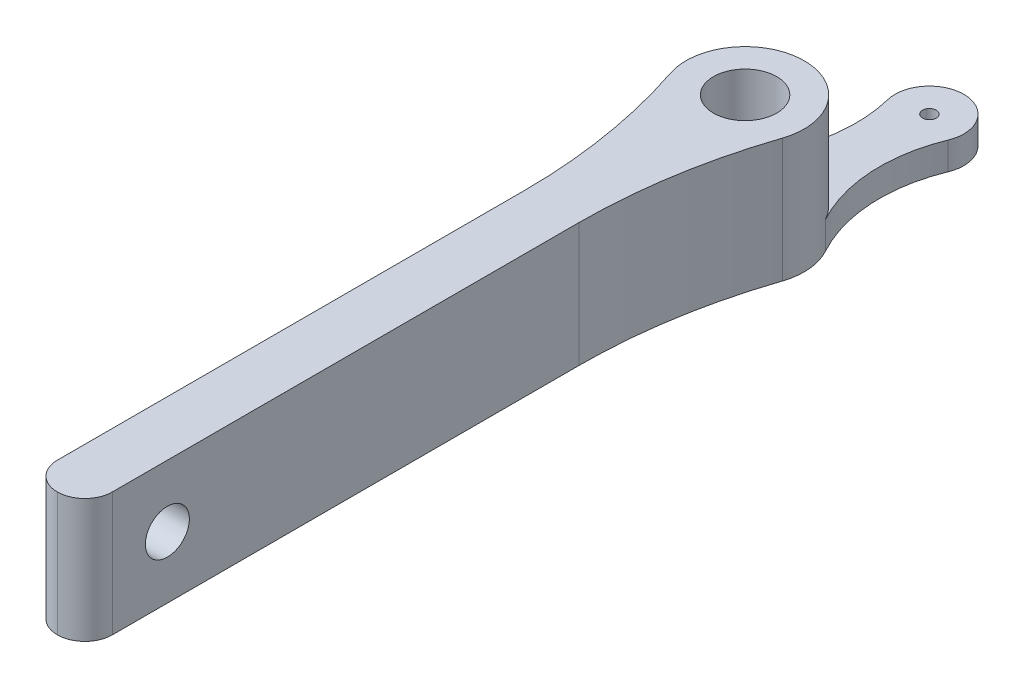
ISO-10303-21;
HEADER;
FILE_DESCRIPTION(('STEP AP214'),'2;1');
FILE_NAME('part.step','',(''),(''),'','','');
FILE_SCHEMA(('AUTOMOTIVE_DESIGN { 1 0 10303 214 1 1 1 1 }'));
ENDSEC;
DATA;
#1=APPLICATION_CONTEXT('core data for automotive mechanical design processes');
#2=APPLICATION_PROTOCOL_DEFINITION('international standard','automotive_design',2000,#1);
#3=PRODUCT_CONTEXT('',#1,'mechanical');
#4=PRODUCT('Part','Part','',(#3));
#5=PRODUCT_RELATED_PRODUCT_CATEGORY('part','',(#4));
#6=PRODUCT_DEFINITION_FORMATION('','',#4);
#7=PRODUCT_DEFINITION_CONTEXT('part definition',#1,'design');
#8=PRODUCT_DEFINITION('design','',#6,#7);
#9=PRODUCT_DEFINITION_SHAPE('','',#8);
#10=(LENGTH_UNIT() NAMED_UNIT(*) SI_UNIT(.MILLI.,.METRE.));
#11=(NAMED_UNIT(*) PLANE_ANGLE_UNIT() SI_UNIT($,.RADIAN.));
#12=(NAMED_UNIT(*) SI_UNIT($,.STERADIAN.) SOLID_ANGLE_UNIT());
#13=UNCERTAINTY_MEASURE_WITH_UNIT(LENGTH_MEASURE(1.E-05),#10,'distance_accuracy_value','');
#14=(GEOMETRIC_REPRESENTATION_CONTEXT(3) GLOBAL_UNCERTAINTY_ASSIGNED_CONTEXT((#13)) GLOBAL_UNIT_ASSIGNED_CONTEXT((#10,
#11,#12)) REPRESENTATION_CONTEXT('',''));
#15=CARTESIAN_POINT('',(0.,0.,0.));
#16=DIRECTION('',(0.,0.,1.));
#17=DIRECTION('',(1.,0.,0.));
#18=AXIS2_PLACEMENT_3D('',#15,#16,#17);
#19=CARTESIAN_POINT('',(0.,57.15,0.));
#20=DIRECTION('',(0.,-1.,0.));
#21=DIRECTION('',(0.,0.,-1.));
#22=AXIS2_PLACEMENT_3D('',#19,#20,#21);
#23=CYLINDRICAL_SURFACE('',#22,27.305);
#24=DIRECTION('',(0.,-1.,0.));
#25=VECTOR('',#24,1.);
#26=CARTESIAN_POINT('',(23.9257190893065,12.7,-13.1576210258387));
#27=LINE('',#26,#25);
#28=CARTESIAN_POINT('',(23.9257190893065,12.7,-13.1576210258387));
#29=VERTEX_POINT('',#28);
#30=CARTESIAN_POINT('',(23.9257190893065,0.,-13.1576210258387));
#31=VERTEX_POINT('',#30);
#32=EDGE_CURVE('E246',#29,#31,#27,.T.);
#33=ORIENTED_EDGE('',*,*,#32,.F.);
#34=CARTESIAN_POINT('',(0.,12.7,0.));
#35=DIRECTION('',(0.,-1.,0.));
#36=DIRECTION('',(0.,0.,1.));
#37=AXIS2_PLACEMENT_3D('',#34,#35,#36);
#38=CIRCLE('',#37,27.305);
#39=CARTESIAN_POINT('',(-21.7584687923652,12.7,-16.4964256980616));
#40=VERTEX_POINT('',#39);
#41=EDGE_CURVE('E140',#40,#29,#38,.T.);
#42=ORIENTED_EDGE('',*,*,#41,.F.);
#43=DIRECTION('',(0.,-1.,0.));
#44=VECTOR('',#43,1.);
#45=CARTESIAN_POINT('',(-21.7584687923652,12.7,-16.4964256980616));
#46=LINE('',#45,#44);
#47=CARTESIAN_POINT('',(-21.7584687923652,0.,-16.4964256980616));
#48=VERTEX_POINT('',#47);
#49=EDGE_CURVE('E153',#40,#48,#46,.T.);
#50=ORIENTED_EDGE('',*,*,#49,.T.);
#51=CARTESIAN_POINT('',(0.,0.,0.));
#52=DIRECTION('',(0.,1.,0.));
#53=DIRECTION('',(0.,0.,1.));
#54=AXIS2_PLACEMENT_3D('',#51,#52,#53);
#55=CIRCLE('',#54,27.305);
#56=CARTESIAN_POINT('',(-25.8873589164786,0.,8.68375917039493));
#57=VERTEX_POINT('',#56);
#58=EDGE_CURVE('E160',#48,#57,#55,.T.);
#59=ORIENTED_EDGE('',*,*,#58,.T.);
#60=DIRECTION('',(0.,-1.,0.));
#61=VECTOR('',#60,1.);
#62=CARTESIAN_POINT('',(-25.8873589164786,57.15,8.68375917039493));
#63=LINE('',#62,#61);
#64=CARTESIAN_POINT('',(-25.8873589164786,57.15,8.68375917039493));
#65=VERTEX_POINT('',#64);
#66=EDGE_CURVE('E172',#57,#65,#63,.F.);
#67=ORIENTED_EDGE('',*,*,#66,.T.);
#68=CARTESIAN_POINT('',(0.,57.15,0.));
#69=DIRECTION('',(0.,1.,0.));
#70=DIRECTION('',(0.,0.,1.));
#71=AXIS2_PLACEMENT_3D('',#68,#69,#70);
#72=CIRCLE('',#71,27.305);
#73=CARTESIAN_POINT('',(25.8873589164786,57.15,8.68375917039493));
#74=VERTEX_POINT('',#73);
#75=EDGE_CURVE('E164',#74,#65,#72,.T.);
#76=ORIENTED_EDGE('',*,*,#75,.F.);
#77=DIRECTION('',(0.,-1.,0.));
#78=VECTOR('',#77,1.);
#79=CARTESIAN_POINT('',(25.8873589164786,57.15,8.68375917039493));
#80=LINE('',#79,#78);
#81=CARTESIAN_POINT('',(25.8873589164786,0.,8.68375917039493));
#82=VERTEX_POINT('',#81);
#83=EDGE_CURVE('E181',#74,#82,#80,.T.);
#84=ORIENTED_EDGE('',*,*,#83,.T.);
#85=EDGE_CURVE('E173',#82,#31,#55,.T.);
#86=ORIENTED_EDGE('',*,*,#85,.T.);
#87=EDGE_LOOP('',(#33,#42,#50,#59,#67,#76,#84,#86));
#88=FACE_BOUND('',#87,.T.);
#89=ADVANCED_FACE('F43',(#88),#23,.T.);
#90=CARTESIAN_POINT('',(0.,57.15,0.));
#91=DIRECTION('',(0.,1.,0.));
#92=DIRECTION('',(0.,0.,1.));
#93=AXIS2_PLACEMENT_3D('',#90,#91,#92);
#94=PLANE('',#93);
#95=DIRECTION('',(0.,0.,1.));
#96=VECTOR('',#95,1.);
#97=CARTESIAN_POINT('',(-12.7000000000001,57.15,24.1717402145563));
#98=LINE('',#97,#96);
#99=CARTESIAN_POINT('',(-12.7000000000001,57.15,89.462914243836));
#100=VERTEX_POINT('',#99);
#101=CARTESIAN_POINT('',(-12.7,57.15,304.8));
#102=VERTEX_POINT('',#101);
#103=EDGE_CURVE('E167',#100,#102,#98,.T.);
#104=ORIENTED_EDGE('',*,*,#103,.T.);
#105=CARTESIAN_POINT('',(0.,57.15,304.8));
#106=DIRECTION('',(0.,1.,0.));
#107=DIRECTION('',(0.,0.,1.));
#108=AXIS2_PLACEMENT_3D('',#105,#106,#107);
#109=CIRCLE('',#108,12.7);
#110=CARTESIAN_POINT('',(0.,57.15,317.5));
#111=VERTEX_POINT('',#110);
#112=EDGE_CURVE('E52',#102,#111,#109,.T.);
#113=ORIENTED_EDGE('',*,*,#112,.T.);
#114=CARTESIAN_POINT('',(0.,57.15,304.8));
#115=DIRECTION('',(0.,1.,0.));
#116=DIRECTION('',(0.,0.,1.));
#117=AXIS2_PLACEMENT_3D('',#114,#115,#116);
#118=CIRCLE('',#117,12.7);
#119=CARTESIAN_POINT('',(12.7,57.15,304.8));
#120=VERTEX_POINT('',#119);
#121=EDGE_CURVE('E62',#111,#120,#118,.T.);
#122=ORIENTED_EDGE('',*,*,#121,.T.);
#123=DIRECTION('',(0.,0.,-1.));
#124=VECTOR('',#123,1.);
#125=CARTESIAN_POINT('',(12.7000000000001,57.15,24.1717402145563));
#126=LINE('',#125,#124);
#127=CARTESIAN_POINT('',(12.7000000000001,57.15,89.462914243836));
#128=VERTEX_POINT('',#127);
#129=EDGE_CURVE('E170',#120,#128,#126,.T.);
#130=ORIENTED_EDGE('',*,*,#129,.T.);
#131=CARTESIAN_POINT('',(266.7,57.15,89.4629142438361));
#132=DIRECTION('',(0.,1.,0.));
#133=DIRECTION('',(0.,0.,1.));
#134=AXIS2_PLACEMENT_3D('',#131,#132,#133);
#135=CIRCLE('',#134,254.);
#136=EDGE_CURVE('E193',#128,#74,#135,.F.);
#137=ORIENTED_EDGE('',*,*,#136,.T.);
#138=ORIENTED_EDGE('',*,*,#75,.T.);
#139=CARTESIAN_POINT('',(-266.7,57.15,89.4629142438361));
#140=DIRECTION('',(0.,1.,0.));
#141=DIRECTION('',(0.,0.,1.));
#142=AXIS2_PLACEMENT_3D('',#139,#140,#141);
#143=CIRCLE('',#142,254.);
#144=EDGE_CURVE('E198',#65,#100,#143,.F.);
#145=ORIENTED_EDGE('',*,*,#144,.T.);
#146=EDGE_LOOP('',(#104,#113,#122,#130,#137,#138,#145));
#147=FACE_BOUND('',#146,.T.);
#148=CARTESIAN_POINT('',(0.,57.15,0.));
#149=DIRECTION('',(0.,1.,0.));
#150=DIRECTION('',(0.,0.,1.));
#151=AXIS2_PLACEMENT_3D('',#148,#149,#150);
#152=CIRCLE('',#151,14.605);
#153=CARTESIAN_POINT('',(0.,57.15,14.605));
#154=VERTEX_POINT('',#153);
#155=EDGE_CURVE('E157',#154,#154,#152,.T.);
#156=ORIENTED_EDGE('',*,*,#155,.F.);
#157=EDGE_LOOP('',(#156));
#158=FACE_BOUND('',#157,.T.);
#159=ADVANCED_FACE('F218',(#147,#158),#94,.T.);
#160=CARTESIAN_POINT('',(0.,0.,0.));
#161=DIRECTION('',(0.,1.,0.));
#162=DIRECTION('',(0.,0.,1.));
#163=AXIS2_PLACEMENT_3D('',#160,#161,#162);
#164=PLANE('',#163);
#165=CARTESIAN_POINT('',(0.,0.,304.8));
#166=DIRECTION('',(0.,1.,0.));
#167=DIRECTION('',(0.,0.,1.));
#168=AXIS2_PLACEMENT_3D('',#165,#166,#167);
#169=CIRCLE('',#168,12.7);
#170=CARTESIAN_POINT('',(12.7,0.,304.8));
#171=VERTEX_POINT('',#170);
#172=CARTESIAN_POINT('',(0.,0.,317.5));
#173=VERTEX_POINT('',#172);
#174=EDGE_CURVE('E200',#171,#173,#169,.F.);
#175=ORIENTED_EDGE('',*,*,#174,.T.);
#176=CARTESIAN_POINT('',(0.,0.,304.8));
#177=DIRECTION('',(0.,1.,0.));
#178=DIRECTION('',(0.,0.,1.));
#179=AXIS2_PLACEMENT_3D('',#176,#177,#178);
#180=CIRCLE('',#179,12.7);
#181=CARTESIAN_POINT('',(-12.7,0.,304.8));
#182=VERTEX_POINT('',#181);
#183=EDGE_CURVE('E204',#173,#182,#180,.F.);
#184=ORIENTED_EDGE('',*,*,#183,.T.);
#185=DIRECTION('',(0.,0.,1.));
#186=VECTOR('',#185,1.);
#187=CARTESIAN_POINT('',(-12.7000000000001,0.,24.1717402145563));
#188=LINE('',#187,#186);
#189=CARTESIAN_POINT('',(-12.7000000000001,0.,89.462914243836));
#190=VERTEX_POINT('',#189);
#191=EDGE_CURVE('E176',#190,#182,#188,.T.);
#192=ORIENTED_EDGE('',*,*,#191,.F.);
#193=CARTESIAN_POINT('',(-266.7,0.,89.4629142438361));
#194=DIRECTION('',(0.,1.,0.));
#195=DIRECTION('',(0.,0.,1.));
#196=AXIS2_PLACEMENT_3D('',#193,#194,#195);
#197=CIRCLE('',#196,254.);
#198=EDGE_CURVE('E195',#190,#57,#197,.T.);
#199=ORIENTED_EDGE('',*,*,#198,.T.);
#200=ORIENTED_EDGE('',*,*,#58,.F.);
#201=CARTESIAN_POINT('',(-77.4196680286484,0.,-58.6965844605449));
#202=DIRECTION('',(0.,-1.,0.));
#203=DIRECTION('',(0.,0.,-1.));
#204=AXIS2_PLACEMENT_3D('',#201,#202,#203);
#205=CIRCLE('',#204,69.85);
#206=CARTESIAN_POINT('',(-9.6152003930738,0.,-75.4768308430126));
#207=VERTEX_POINT('',#206);
#208=EDGE_CURVE('E143',#207,#48,#205,.T.);
#209=ORIENTED_EDGE('',*,*,#208,.F.);
#210=CARTESIAN_POINT('',(5.7949058877386,0.,-79.2905232026643));
#211=DIRECTION('',(0.,1.,0.));
#212=DIRECTION('',(0.,0.,1.));
#213=AXIS2_PLACEMENT_3D('',#210,#211,#212);
#214=CIRCLE('',#213,15.875);
#215=CARTESIAN_POINT('',(20.4867838700433,0.,-73.2768432682921));
#216=VERTEX_POINT('',#215);
#217=EDGE_CURVE('E248',#216,#207,#214,.T.);
#218=ORIENTED_EDGE('',*,*,#217,.F.);
#219=CARTESIAN_POINT('',(85.1310469921837,0.,-46.816651557054));
#220=DIRECTION('',(0.,-1.,0.));
#221=DIRECTION('',(0.,0.,1.));
#222=AXIS2_PLACEMENT_3D('',#219,#220,#221);
#223=CIRCLE('',#222,69.85);
#224=EDGE_CURVE('E147',#31,#216,#223,.T.);
#225=ORIENTED_EDGE('',*,*,#224,.F.);
#226=ORIENTED_EDGE('',*,*,#85,.F.);
#227=CARTESIAN_POINT('',(266.7,0.,89.4629142438361));
#228=DIRECTION('',(0.,1.,0.));
#229=DIRECTION('',(0.,0.,1.));
#230=AXIS2_PLACEMENT_3D('',#227,#228,#229);
#231=CIRCLE('',#230,254.);
#232=CARTESIAN_POINT('',(12.7000000000001,0.,89.462914243836));
#233=VERTEX_POINT('',#232);
#234=EDGE_CURVE('E190',#82,#233,#231,.T.);
#235=ORIENTED_EDGE('',*,*,#234,.T.);
#236=DIRECTION('',(0.,0.,-1.));
#237=VECTOR('',#236,1.);
#238=CARTESIAN_POINT('',(12.7000000000001,0.,24.1717402145563));
#239=LINE('',#238,#237);
#240=EDGE_CURVE('E168',#171,#233,#239,.T.);
#241=ORIENTED_EDGE('',*,*,#240,.F.);
#242=EDGE_LOOP('',(#175,#184,#192,#199,#200,#209,#218,#225,#226,#235,#241));
#243=FACE_BOUND('',#242,.T.);
#244=CARTESIAN_POINT('',(0.,0.,0.));
#245=DIRECTION('',(0.,1.,0.));
#246=DIRECTION('',(0.,0.,1.));
#247=AXIS2_PLACEMENT_3D('',#244,#245,#246);
#248=CIRCLE('',#247,14.605);
#249=CARTESIAN_POINT('',(0.,0.,14.605));
#250=VERTEX_POINT('',#249);
#251=EDGE_CURVE('E161',#250,#250,#248,.T.);
#252=ORIENTED_EDGE('',*,*,#251,.T.);
#253=EDGE_LOOP('',(#252));
#254=FACE_BOUND('',#253,.T.);
#255=CARTESIAN_POINT('',(5.7949058877386,0.,-79.2905232026643));
#256=DIRECTION('',(0.,1.,0.));
#257=DIRECTION('',(0.,0.,1.));
#258=AXIS2_PLACEMENT_3D('',#255,#256,#257);
#259=CIRCLE('',#258,3.175);
#260=CARTESIAN_POINT('',(5.7949058877386,0.,-76.1155232026643));
#261=VERTEX_POINT('',#260);
#262=EDGE_CURVE('E235',#261,#261,#259,.T.);
#263=ORIENTED_EDGE('',*,*,#262,.T.);
#264=EDGE_LOOP('',(#263));
#265=FACE_BOUND('',#264,.T.);
#266=ADVANCED_FACE('F226',(#243,#254,#265),#164,.F.);
#267=CARTESIAN_POINT('',(-12.7000000000001,57.15,24.1717402145563));
#268=DIRECTION('',(1.,0.,0.));
#269=DIRECTION('',(0.,0.,-1.));
#270=AXIS2_PLACEMENT_3D('',#267,#268,#269);
#271=PLANE('',#270);
#272=CARTESIAN_POINT('',(-12.7,28.5750000000001,279.4));
#273=DIRECTION('',(-1.,0.,0.));
#274=DIRECTION('',(0.,0.,1.));
#275=AXIS2_PLACEMENT_3D('',#272,#273,#274);
#276=CIRCLE('',#275,10.16);
#277=CARTESIAN_POINT('',(-12.7,28.5750000000001,289.56));
#278=VERTEX_POINT('',#277);
#279=EDGE_CURVE('E148',#278,#278,#276,.T.);
#280=ORIENTED_EDGE('',*,*,#279,.F.);
#281=EDGE_LOOP('',(#280));
#282=FACE_BOUND('',#281,.T.);
#283=ORIENTED_EDGE('',*,*,#191,.T.);
#284=DIRECTION('',(0.,-1.,0.));
#285=VECTOR('',#284,1.);
#286=CARTESIAN_POINT('',(-12.7,57.15,304.8));
#287=LINE('',#286,#285);
#288=EDGE_CURVE('E206',#182,#102,#287,.F.);
#289=ORIENTED_EDGE('',*,*,#288,.T.);
#290=ORIENTED_EDGE('',*,*,#103,.F.);
#291=DIRECTION('',(0.,1.,0.));
#292=VECTOR('',#291,1.);
#293=CARTESIAN_POINT('',(-12.7000000000001,0.,89.462914243836));
#294=LINE('',#293,#292);
#295=EDGE_CURVE('E187',#100,#190,#294,.F.);
#296=ORIENTED_EDGE('',*,*,#295,.T.);
#297=EDGE_LOOP('',(#283,#289,#290,#296));
#298=FACE_BOUND('',#297,.T.);
#299=ADVANCED_FACE('F213',(#282,#298),#271,.F.);
#300=CARTESIAN_POINT('',(12.7000000000001,57.15,24.1717402145563));
#301=DIRECTION('',(-1.,0.,0.));
#302=DIRECTION('',(0.,0.,1.));
#303=AXIS2_PLACEMENT_3D('',#300,#301,#302);
#304=PLANE('',#303);
#305=CARTESIAN_POINT('',(12.7,28.5750000000001,279.4));
#306=DIRECTION('',(-1.,0.,0.));
#307=DIRECTION('',(0.,0.,1.));
#308=AXIS2_PLACEMENT_3D('',#305,#306,#307);
#309=CIRCLE('',#308,10.16);
#310=CARTESIAN_POINT('',(12.7,28.5750000000001,289.56));
#311=VERTEX_POINT('',#310);
#312=EDGE_CURVE('E151',#311,#311,#309,.T.);
#313=ORIENTED_EDGE('',*,*,#312,.T.);
#314=EDGE_LOOP('',(#313));
#315=FACE_BOUND('',#314,.T.);
#316=ORIENTED_EDGE('',*,*,#129,.F.);
#317=DIRECTION('',(0.,1.,0.));
#318=VECTOR('',#317,1.);
#319=CARTESIAN_POINT('',(12.7,0.,304.8));
#320=LINE('',#319,#318);
#321=EDGE_CURVE('E11',#120,#171,#320,.F.);
#322=ORIENTED_EDGE('',*,*,#321,.T.);
#323=ORIENTED_EDGE('',*,*,#240,.T.);
#324=DIRECTION('',(0.,1.,0.));
#325=VECTOR('',#324,1.);
#326=CARTESIAN_POINT('',(12.7000000000001,57.15,89.462914243836));
#327=LINE('',#326,#325);
#328=EDGE_CURVE('E184',#233,#128,#327,.T.);
#329=ORIENTED_EDGE('',*,*,#328,.T.);
#330=EDGE_LOOP('',(#316,#322,#323,#329));
#331=FACE_BOUND('',#330,.T.);
#332=ADVANCED_FACE('F292',(#315,#331),#304,.F.);
#333=CARTESIAN_POINT('',(0.,57.15,0.));
#334=DIRECTION('',(0.,-1.,0.));
#335=DIRECTION('',(0.,0.,-1.));
#336=AXIS2_PLACEMENT_3D('',#333,#334,#335);
#337=CYLINDRICAL_SURFACE('',#336,14.605);
#338=ORIENTED_EDGE('',*,*,#155,.T.);
#339=EDGE_LOOP('',(#338));
#340=FACE_BOUND('',#339,.T.);
#341=ORIENTED_EDGE('',*,*,#251,.F.);
#342=EDGE_LOOP('',(#341));
#343=FACE_BOUND('',#342,.T.);
#344=ADVANCED_FACE('F280',(#340,#343),#337,.F.);
#345=CARTESIAN_POINT('',(266.7,57.15,89.4629142438361));
#346=DIRECTION('',(0.,-1.,0.));
#347=DIRECTION('',(0.,0.,-1.));
#348=AXIS2_PLACEMENT_3D('',#345,#346,#347);
#349=CYLINDRICAL_SURFACE('',#348,254.);
#350=ORIENTED_EDGE('',*,*,#136,.F.);
#351=ORIENTED_EDGE('',*,*,#328,.F.);
#352=ORIENTED_EDGE('',*,*,#234,.F.);
#353=ORIENTED_EDGE('',*,*,#83,.F.);
#354=EDGE_LOOP('',(#350,#351,#352,#353));
#355=FACE_BOUND('',#354,.T.);
#356=ADVANCED_FACE('F277',(#355),#349,.F.);
#357=CARTESIAN_POINT('',(-266.7,57.15,89.4629142438361));
#358=DIRECTION('',(0.,-1.,0.));
#359=DIRECTION('',(0.,0.,-1.));
#360=AXIS2_PLACEMENT_3D('',#357,#358,#359);
#361=CYLINDRICAL_SURFACE('',#360,254.);
#362=ORIENTED_EDGE('',*,*,#144,.F.);
#363=ORIENTED_EDGE('',*,*,#66,.F.);
#364=ORIENTED_EDGE('',*,*,#198,.F.);
#365=ORIENTED_EDGE('',*,*,#295,.F.);
#366=EDGE_LOOP('',(#362,#363,#364,#365));
#367=FACE_BOUND('',#366,.T.);
#368=ADVANCED_FACE('F224',(#367),#361,.F.);
#369=CARTESIAN_POINT('',(27.3050000000001,28.5750000000001,279.4));
#370=DIRECTION('',(-1.,0.,0.));
#371=DIRECTION('',(0.,0.,1.));
#372=AXIS2_PLACEMENT_3D('',#369,#370,#371);
#373=CYLINDRICAL_SURFACE('',#372,10.16);
#374=ORIENTED_EDGE('',*,*,#279,.T.);
#375=EDGE_LOOP('',(#374));
#376=FACE_BOUND('',#375,.T.);
#377=ORIENTED_EDGE('',*,*,#312,.F.);
#378=EDGE_LOOP('',(#377));
#379=FACE_BOUND('',#378,.T.);
#380=ADVANCED_FACE('F283',(#376,#379),#373,.F.);
#381=CARTESIAN_POINT('',(42.5655234960919,12.7,-23.408325778527));
#382=DIRECTION('',(0.,1.,0.));
#383=DIRECTION('',(0.,0.,1.));
#384=AXIS2_PLACEMENT_3D('',#381,#382,#383);
#385=PLANE('',#384);
#386=CARTESIAN_POINT('',(85.1310469921837,12.7,-46.816651557054));
#387=DIRECTION('',(0.,-1.,0.));
#388=DIRECTION('',(0.,0.,1.));
#389=AXIS2_PLACEMENT_3D('',#386,#387,#388);
#390=CIRCLE('',#389,69.85);
#391=CARTESIAN_POINT('',(20.4867838700433,12.7,-73.2768432682921));
#392=VERTEX_POINT('',#391);
#393=EDGE_CURVE('E134',#29,#392,#390,.T.);
#394=ORIENTED_EDGE('',*,*,#393,.T.);
#395=CARTESIAN_POINT('',(5.7949058877386,12.7,-79.2905232026643));
#396=DIRECTION('',(0.,1.,0.));
#397=DIRECTION('',(0.,0.,1.));
#398=AXIS2_PLACEMENT_3D('',#395,#396,#397);
#399=CIRCLE('',#398,15.875);
#400=CARTESIAN_POINT('',(-9.6152003930738,12.7,-75.4768308430126));
#401=VERTEX_POINT('',#400);
#402=EDGE_CURVE('E123',#392,#401,#399,.T.);
#403=ORIENTED_EDGE('',*,*,#402,.T.);
#404=CARTESIAN_POINT('',(-77.4196680286484,12.7,-58.6965844605449));
#405=DIRECTION('',(0.,-1.,0.));
#406=DIRECTION('',(0.,0.,-1.));
#407=AXIS2_PLACEMENT_3D('',#404,#405,#406);
#408=CIRCLE('',#407,69.85);
#409=EDGE_CURVE('E133',#401,#40,#408,.T.);
#410=ORIENTED_EDGE('',*,*,#409,.T.);
#411=ORIENTED_EDGE('',*,*,#41,.T.);
#412=EDGE_LOOP('',(#394,#403,#410,#411));
#413=FACE_BOUND('',#412,.T.);
#414=CARTESIAN_POINT('',(5.7949058877386,12.7,-79.2905232026643));
#415=DIRECTION('',(0.,1.,0.));
#416=DIRECTION('',(0.,0.,1.));
#417=AXIS2_PLACEMENT_3D('',#414,#415,#416);
#418=CIRCLE('',#417,3.175);
#419=CARTESIAN_POINT('',(5.7949058877386,12.7,-76.1155232026643));
#420=VERTEX_POINT('',#419);
#421=EDGE_CURVE('E237',#420,#420,#418,.T.);
#422=ORIENTED_EDGE('',*,*,#421,.F.);
#423=EDGE_LOOP('',(#422));
#424=FACE_BOUND('',#423,.T.);
#425=ADVANCED_FACE('F137',(#413,#424),#385,.T.);
#426=CARTESIAN_POINT('',(85.1310469921837,12.7,-46.816651557054));
#427=DIRECTION('',(0.,-1.,0.));
#428=DIRECTION('',(0.,0.,-1.));
#429=AXIS2_PLACEMENT_3D('',#426,#427,#428);
#430=CYLINDRICAL_SURFACE('',#429,69.85);
#431=ORIENTED_EDGE('',*,*,#224,.T.);
#432=DIRECTION('',(0.,-1.,0.));
#433=VECTOR('',#432,1.);
#434=CARTESIAN_POINT('',(20.4867838700433,12.7,-73.2768432682921));
#435=LINE('',#434,#433);
#436=EDGE_CURVE('E127',#392,#216,#435,.T.);
#437=ORIENTED_EDGE('',*,*,#436,.F.);
#438=ORIENTED_EDGE('',*,*,#393,.F.);
#439=ORIENTED_EDGE('',*,*,#32,.T.);
#440=EDGE_LOOP('',(#431,#437,#438,#439));
#441=FACE_BOUND('',#440,.T.);
#442=ADVANCED_FACE('F145',(#441),#430,.F.);
#443=CARTESIAN_POINT('',(5.7949058877386,12.7,-79.2905232026643));
#444=DIRECTION('',(0.,-1.,0.));
#445=DIRECTION('',(0.,0.,-1.));
#446=AXIS2_PLACEMENT_3D('',#443,#444,#445);
#447=CYLINDRICAL_SURFACE('',#446,15.875);
#448=ORIENTED_EDGE('',*,*,#217,.T.);
#449=DIRECTION('',(0.,-1.,0.));
#450=VECTOR('',#449,1.);
#451=CARTESIAN_POINT('',(-9.6152003930738,12.7,-75.4768308430126));
#452=LINE('',#451,#450);
#453=EDGE_CURVE('E130',#401,#207,#452,.T.);
#454=ORIENTED_EDGE('',*,*,#453,.F.);
#455=ORIENTED_EDGE('',*,*,#402,.F.);
#456=ORIENTED_EDGE('',*,*,#436,.T.);
#457=EDGE_LOOP('',(#448,#454,#455,#456));
#458=FACE_BOUND('',#457,.T.);
#459=ADVANCED_FACE('F125',(#458),#447,.T.);
#460=CARTESIAN_POINT('',(-77.4196680286484,12.7,-58.6965844605449));
#461=DIRECTION('',(0.,-1.,0.));
#462=DIRECTION('',(0.,0.,-1.));
#463=AXIS2_PLACEMENT_3D('',#460,#461,#462);
#464=CYLINDRICAL_SURFACE('',#463,69.85);
#465=ORIENTED_EDGE('',*,*,#208,.T.);
#466=ORIENTED_EDGE('',*,*,#49,.F.);
#467=ORIENTED_EDGE('',*,*,#409,.F.);
#468=ORIENTED_EDGE('',*,*,#453,.T.);
#469=EDGE_LOOP('',(#465,#466,#467,#468));
#470=FACE_BOUND('',#469,.T.);
#471=ADVANCED_FACE('F256',(#470),#464,.F.);
#472=CARTESIAN_POINT('',(5.7949058877386,12.7,-79.2905232026643));
#473=DIRECTION('',(0.,-1.,0.));
#474=DIRECTION('',(0.,0.,-1.));
#475=AXIS2_PLACEMENT_3D('',#472,#473,#474);
#476=CYLINDRICAL_SURFACE('',#475,3.175);
#477=ORIENTED_EDGE('',*,*,#421,.T.);
#478=EDGE_LOOP('',(#477));
#479=FACE_BOUND('',#478,.T.);
#480=ORIENTED_EDGE('',*,*,#262,.F.);
#481=EDGE_LOOP('',(#480));
#482=FACE_BOUND('',#481,.T.);
#483=ADVANCED_FACE('F258',(#479,#482),#476,.F.);
#484=CARTESIAN_POINT('',(0.,0.,304.8));
#485=DIRECTION('',(0.,-1.,0.));
#486=DIRECTION('',(0.,0.,-1.));
#487=AXIS2_PLACEMENT_3D('',#484,#485,#486);
#488=CYLINDRICAL_SURFACE('',#487,12.7);
#489=ORIENTED_EDGE('',*,*,#321,.F.);
#490=ORIENTED_EDGE('',*,*,#121,.F.);
#491=DIRECTION('',(0.,1.,0.));
#492=VECTOR('',#491,1.);
#493=CARTESIAN_POINT('',(0.,57.15,317.5));
#494=LINE('',#493,#492);
#495=EDGE_CURVE('E47',#173,#111,#494,.T.);
#496=ORIENTED_EDGE('',*,*,#495,.F.);
#497=ORIENTED_EDGE('',*,*,#174,.F.);
#498=EDGE_LOOP('',(#489,#490,#496,#497));
#499=FACE_BOUND('',#498,.T.);
#500=ADVANCED_FACE('F45',(#499),#488,.T.);
#501=CARTESIAN_POINT('',(0.,0.,304.8));
#502=DIRECTION('',(0.,1.,0.));
#503=DIRECTION('',(0.,0.,1.));
#504=AXIS2_PLACEMENT_3D('',#501,#502,#503);
#505=CYLINDRICAL_SURFACE('',#504,12.7);
#506=ORIENTED_EDGE('',*,*,#112,.F.);
#507=ORIENTED_EDGE('',*,*,#288,.F.);
#508=ORIENTED_EDGE('',*,*,#183,.F.);
#509=ORIENTED_EDGE('',*,*,#495,.T.);
#510=EDGE_LOOP('',(#506,#507,#508,#509));
#511=FACE_BOUND('',#510,.T.);
#512=ADVANCED_FACE('F233',(#511),#505,.T.);
#513=CLOSED_SHELL('',(#89,#159,#266,#299,#332,#344,#356,#368,#380,#425,#442,#459,#471,#483,#500,#512));
#514=MANIFOLD_SOLID_BREP('B2',#513);
#515=ADVANCED_BREP_SHAPE_REPRESENTATION('',(#18,#514),#14);
#516=SHAPE_DEFINITION_REPRESENTATION(#9,#515);
ENDSEC;
END-ISO-10303-21;
